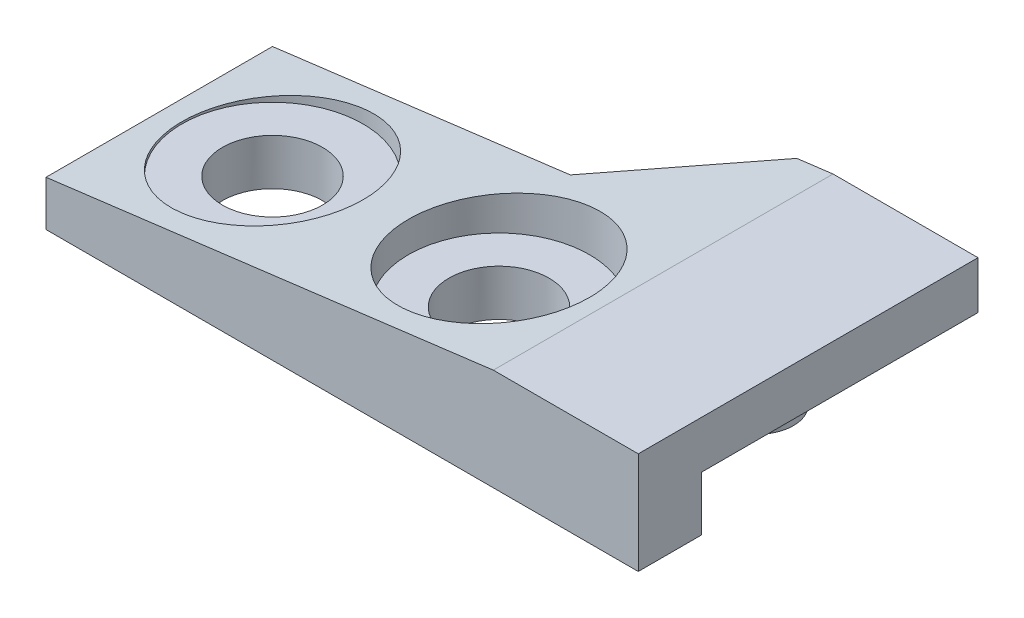
ISO-10303-21;
HEADER;
FILE_DESCRIPTION(('STEP AP214'),'2;1');
FILE_NAME('part.step','',(''),(''),'','','');
FILE_SCHEMA(('AUTOMOTIVE_DESIGN { 1 0 10303 214 1 1 1 1 }'));
ENDSEC;
DATA;
#1=APPLICATION_CONTEXT('core data for automotive mechanical design processes');
#2=APPLICATION_PROTOCOL_DEFINITION('international standard','automotive_design',2000,#1);
#3=PRODUCT_CONTEXT('',#1,'mechanical');
#4=PRODUCT('Part','Part','',(#3));
#5=PRODUCT_RELATED_PRODUCT_CATEGORY('part','',(#4));
#6=PRODUCT_DEFINITION_FORMATION('','',#4);
#7=PRODUCT_DEFINITION_CONTEXT('part definition',#1,'design');
#8=PRODUCT_DEFINITION('design','',#6,#7);
#9=PRODUCT_DEFINITION_SHAPE('','',#8);
#10=(LENGTH_UNIT() NAMED_UNIT(*) SI_UNIT(.MILLI.,.METRE.));
#11=(NAMED_UNIT(*) PLANE_ANGLE_UNIT() SI_UNIT($,.RADIAN.));
#12=(NAMED_UNIT(*) SI_UNIT($,.STERADIAN.) SOLID_ANGLE_UNIT());
#13=UNCERTAINTY_MEASURE_WITH_UNIT(LENGTH_MEASURE(1.E-05),#10,'distance_accuracy_value','');
#14=(GEOMETRIC_REPRESENTATION_CONTEXT(3) GLOBAL_UNCERTAINTY_ASSIGNED_CONTEXT((#13)) GLOBAL_UNIT_ASSIGNED_CONTEXT((#10,
#11,#12)) REPRESENTATION_CONTEXT('',''));
#15=CARTESIAN_POINT('',(0.,0.,0.));
#16=DIRECTION('',(0.,0.,1.));
#17=DIRECTION('',(1.,0.,0.));
#18=AXIS2_PLACEMENT_3D('',#15,#16,#17);
#19=CARTESIAN_POINT('',(-49.7205,0.,-4.59678591487508E-13));
#20=DIRECTION('',(1.,0.,0.));
#21=DIRECTION('',(0.,0.,1.));
#22=AXIS2_PLACEMENT_3D('',#19,#20,#21);
#23=PLANE('',#22);
#24=CARTESIAN_POINT('',(-49.7205,2.54,-4.59678591487508E-13));
#25=DIRECTION('',(0.,-1.,0.));
#26=VECTOR('',#25,1.);
#27=LINE('',#24,#26);
#28=CARTESIAN_POINT('',(-49.7205,2.54,-4.59678591487508E-13));
#29=VERTEX_POINT('',#28);
#30=CARTESIAN_POINT('',(-49.7205,0.,-4.59678591487508E-13));
#31=VERTEX_POINT('',#30);
#32=EDGE_CURVE('E229',#29,#31,#27,.T.);
#33=ORIENTED_EDGE('',*,*,#32,.F.);
#34=CARTESIAN_POINT('',(-49.7204999999998,2.54,-12.7000000000005));
#35=DIRECTION('',(0.,0.,1.));
#36=VECTOR('',#35,1.);
#37=LINE('',#34,#36);
#38=CARTESIAN_POINT('',(-49.7204999999998,2.54,-12.7000000000005));
#39=VERTEX_POINT('',#38);
#40=EDGE_CURVE('E676',#39,#29,#37,.T.);
#41=ORIENTED_EDGE('',*,*,#40,.F.);
#42=CARTESIAN_POINT('',(-49.7204999999998,0.,-12.7000000000005));
#43=DIRECTION('',(0.,1.,0.));
#44=VECTOR('',#43,1.);
#45=LINE('',#42,#44);
#46=CARTESIAN_POINT('',(-49.7204999999998,0.,-12.7000000000005));
#47=VERTEX_POINT('',#46);
#48=EDGE_CURVE('E479',#47,#39,#45,.T.);
#49=ORIENTED_EDGE('',*,*,#48,.F.);
#50=CARTESIAN_POINT('',(-49.7205,0.,-4.59678591487508E-13));
#51=DIRECTION('',(0.,0.,-1.));
#52=VECTOR('',#51,1.);
#53=LINE('',#50,#52);
#54=EDGE_CURVE('E285',#31,#47,#53,.T.);
#55=ORIENTED_EDGE('',*,*,#54,.F.);
#56=EDGE_LOOP('',(#33,#41,#49,#55));
#57=FACE_BOUND('',#56,.T.);
#58=ADVANCED_FACE('F49',(#57),#23,.F.);
#59=CARTESIAN_POINT('',(-33.02,0.,-2.28520905902011E-13));
#60=DIRECTION('',(0.,-1.,0.));
#61=DIRECTION('',(0.,0.,-1.));
#62=AXIS2_PLACEMENT_3D('',#59,#60,#61);
#63=PLANE('',#62);
#64=DIRECTION('',(1.,0.,0.));
#65=VECTOR('',#64,1.);
#66=CARTESIAN_POINT('',(-16.5100000000001,0.,-3.556));
#67=LINE('',#66,#65);
#68=CARTESIAN_POINT('',(-26.0350000000001,0.,-3.55600000000013));
#69=VERTEX_POINT('',#68);
#70=CARTESIAN_POINT('',(-16.5100000000001,0.,-3.556));
#71=VERTEX_POINT('',#70);
#72=EDGE_CURVE('E153',#69,#71,#67,.T.);
#73=ORIENTED_EDGE('',*,*,#72,.T.);
#74=CARTESIAN_POINT('',(-16.5100000000001,0.,-3.556));
#75=DIRECTION('',(0.,0.,1.));
#76=VECTOR('',#75,1.);
#77=LINE('',#74,#76);
#78=CARTESIAN_POINT('',(-16.51,0.,-1.46938232624621E-13));
#79=VERTEX_POINT('',#78);
#80=EDGE_CURVE('E167',#71,#79,#77,.T.);
#81=ORIENTED_EDGE('',*,*,#80,.T.);
#82=DIRECTION('',(1.,0.,0.));
#83=VECTOR('',#82,1.);
#84=CARTESIAN_POINT('',(-49.7205,0.,-4.59678591487508E-13));
#85=LINE('',#84,#83);
#86=EDGE_CURVE('E290',#31,#79,#85,.T.);
#87=ORIENTED_EDGE('',*,*,#86,.F.);
#88=ORIENTED_EDGE('',*,*,#54,.T.);
#89=DIRECTION('',(1.,0.,0.));
#90=VECTOR('',#89,1.);
#91=CARTESIAN_POINT('',(-49.7204999999998,0.,-12.7000000000005));
#92=LINE('',#91,#90);
#93=CARTESIAN_POINT('',(-33.0199999999998,0.,-12.7000000000002));
#94=VERTEX_POINT('',#93);
#95=EDGE_CURVE('E299',#47,#94,#92,.T.);
#96=ORIENTED_EDGE('',*,*,#95,.T.);
#97=DIRECTION('',(0.707106781186553,0.,-0.707106781186542));
#98=VECTOR('',#97,1.);
#99=CARTESIAN_POINT('',(-33.0199999999998,0.,-12.7000000000002));
#100=LINE('',#99,#98);
#101=CARTESIAN_POINT('',(-26.6699999999997,0.,-19.0500000000003));
#102=VERTEX_POINT('',#101);
#103=EDGE_CURVE('E248',#94,#102,#100,.T.);
#104=ORIENTED_EDGE('',*,*,#103,.T.);
#105=DIRECTION('',(1.,0.,0.));
#106=VECTOR('',#105,1.);
#107=CARTESIAN_POINT('',(-26.6699999999997,0.,-19.0500000000003));
#108=LINE('',#107,#106);
#109=CARTESIAN_POINT('',(-26.0349999999999,0.,-19.0500000000003));
#110=VERTEX_POINT('',#109);
#111=EDGE_CURVE('E258',#102,#110,#108,.T.);
#112=ORIENTED_EDGE('',*,*,#111,.T.);
#113=DIRECTION('',(0.,0.,1.));
#114=VECTOR('',#113,1.);
#115=CARTESIAN_POINT('',(-26.0350000000001,0.,-3.55600000000013));
#116=LINE('',#115,#114);
#117=EDGE_CURVE('E448',#110,#69,#116,.T.);
#118=ORIENTED_EDGE('',*,*,#117,.T.);
#119=EDGE_LOOP('',(#73,#81,#87,#88,#96,#104,#112,#118));
#120=FACE_BOUND('',#119,.T.);
#121=CARTESIAN_POINT('',(-43.3704999999999,0.,-6.35000000000037));
#122=DIRECTION('',(0.,1.,0.));
#123=DIRECTION('',(0.,0.,-1.));
#124=AXIS2_PLACEMENT_3D('',#121,#122,#123);
#125=CIRCLE('',#124,2.8067);
#126=CARTESIAN_POINT('',(-43.3704999999999,0.,-9.15670000000037));
#127=VERTEX_POINT('',#126);
#128=EDGE_CURVE('E351',#127,#127,#125,.T.);
#129=ORIENTED_EDGE('',*,*,#128,.T.);
#130=EDGE_LOOP('',(#129));
#131=FACE_BOUND('',#130,.T.);
#132=CARTESIAN_POINT('',(-30.6704999999999,0.,-6.3500000000002));
#133=DIRECTION('',(0.,1.,0.));
#134=DIRECTION('',(0.,0.,-1.));
#135=AXIS2_PLACEMENT_3D('',#132,#133,#134);
#136=CIRCLE('',#135,2.8067);
#137=CARTESIAN_POINT('',(-30.6704999999999,0.,-9.15670000000019));
#138=VERTEX_POINT('',#137);
#139=EDGE_CURVE('E341',#138,#138,#136,.T.);
#140=ORIENTED_EDGE('',*,*,#139,.T.);
#141=EDGE_LOOP('',(#140));
#142=FACE_BOUND('',#141,.T.);
#143=ADVANCED_FACE('F199',(#120,#131,#142),#63,.T.);
#144=CARTESIAN_POINT('',(-33.0199999999998,0.,-12.7000000000002));
#145=DIRECTION('',(0.,0.,-1.));
#146=DIRECTION('',(1.,0.,0.));
#147=AXIS2_PLACEMENT_3D('',#144,#145,#146);
#148=PLANE('',#147);
#149=ORIENTED_EDGE('',*,*,#95,.F.);
#150=ORIENTED_EDGE('',*,*,#48,.T.);
#151=DIRECTION('',(0.992083472687499,0.125580186416139,0.));
#152=VECTOR('',#151,1.);
#153=CARTESIAN_POINT('',(-49.7204999999998,2.54,-12.7000000000005));
#154=LINE('',#153,#152);
#155=CARTESIAN_POINT('',(-33.0199999999998,4.65398734177215,-12.7000000000002));
#156=VERTEX_POINT('',#155);
#157=EDGE_CURVE('E243',#39,#156,#154,.T.);
#158=ORIENTED_EDGE('',*,*,#157,.T.);
#159=DIRECTION('',(0.,1.,0.));
#160=VECTOR('',#159,1.);
#161=CARTESIAN_POINT('',(-33.0199999999998,0.,-12.7000000000002));
#162=LINE('',#161,#160);
#163=EDGE_CURVE('E233',#94,#156,#162,.T.);
#164=ORIENTED_EDGE('',*,*,#163,.F.);
#165=EDGE_LOOP('',(#149,#150,#158,#164));
#166=FACE_BOUND('',#165,.T.);
#167=ADVANCED_FACE('F321',(#166),#148,.T.);
#168=CARTESIAN_POINT('',(-33.02,0.,-2.28520905902011E-13));
#169=DIRECTION('',(0.,0.,1.));
#170=DIRECTION('',(-1.,0.,0.));
#171=AXIS2_PLACEMENT_3D('',#168,#169,#170);
#172=PLANE('',#171);
#173=DIRECTION('',(0.992083472687499,0.125580186416139,0.));
#174=VECTOR('',#173,1.);
#175=CARTESIAN_POINT('',(-49.7205,2.54,-4.59678591487508E-13));
#176=LINE('',#175,#174);
#177=CARTESIAN_POINT('',(-24.638,5.715,-1.12502599828683E-13));
#178=VERTEX_POINT('',#177);
#179=EDGE_CURVE('E304',#29,#178,#176,.T.);
#180=ORIENTED_EDGE('',*,*,#179,.F.);
#181=ORIENTED_EDGE('',*,*,#32,.T.);
#182=ORIENTED_EDGE('',*,*,#86,.T.);
#183=CARTESIAN_POINT('',(-16.51,0.,0.));
#184=DIRECTION('',(0.,1.,0.));
#185=VECTOR('',#184,1.);
#186=LINE('',#183,#185);
#187=CARTESIAN_POINT('',(-16.51,5.715,0.));
#188=VERTEX_POINT('',#187);
#189=EDGE_CURVE('E346',#79,#188,#186,.T.);
#190=ORIENTED_EDGE('',*,*,#189,.T.);
#191=DIRECTION('',(1.,0.,0.));
#192=VECTOR('',#191,1.);
#193=CARTESIAN_POINT('',(-24.638,5.715,-1.12502599828683E-13));
#194=LINE('',#193,#192);
#195=EDGE_CURVE('E334',#178,#188,#194,.T.);
#196=ORIENTED_EDGE('',*,*,#195,.F.);
#197=EDGE_LOOP('',(#180,#181,#182,#190,#196));
#198=FACE_BOUND('',#197,.T.);
#199=ADVANCED_FACE('F313',(#198),#172,.T.);
#200=CARTESIAN_POINT('',(-33.5998217946696,4.58059217788992,-2.36546429934696E-13));
#201=DIRECTION('',(-0.125580186416139,0.992083472687499,0.));
#202=DIRECTION('',(0.992083472687499,0.125580186416139,0.));
#203=AXIS2_PLACEMENT_3D('',#200,#201,#202);
#204=PLANE('',#203);
#205=CARTESIAN_POINT('',(-43.3704999999999,3.34379746835443,-6.35000000000037));
#206=DIRECTION('',(0.125580186416139,-0.992083472687499,0.));
#207=DIRECTION('',(0.992083472687499,0.125580186416139,0.));
#208=AXIS2_PLACEMENT_3D('',#205,#206,#207);
#209=ELLIPSE('',#208,5.12053686998591,5.08);
#210=CARTESIAN_POINT('',(-38.2904999999999,3.98683544303798,-6.35000000000031));
#211=VERTEX_POINT('',#210);
#212=EDGE_CURVE('E347',#211,#211,#209,.T.);
#213=ORIENTED_EDGE('',*,*,#212,.T.);
#214=EDGE_LOOP('',(#213));
#215=FACE_BOUND('',#214,.T.);
#216=CARTESIAN_POINT('',(-30.6704999999999,4.95139240506329,-6.3500000000002));
#217=DIRECTION('',(0.125580186416139,-0.992083472687499,0.));
#218=DIRECTION('',(0.992083472687499,0.125580186416139,0.));
#219=AXIS2_PLACEMENT_3D('',#216,#217,#218);
#220=ELLIPSE('',#219,5.12053686998591,5.08);
#221=CARTESIAN_POINT('',(-25.5904999999999,5.59443037974684,-6.35000000000013));
#222=VERTEX_POINT('',#221);
#223=EDGE_CURVE('E337',#222,#222,#220,.T.);
#224=ORIENTED_EDGE('',*,*,#223,.T.);
#225=EDGE_LOOP('',(#224));
#226=FACE_BOUND('',#225,.T.);
#227=ORIENTED_EDGE('',*,*,#157,.F.);
#228=ORIENTED_EDGE('',*,*,#40,.T.);
#229=ORIENTED_EDGE('',*,*,#179,.T.);
#230=DIRECTION('',(0.,0.,1.));
#231=VECTOR('',#230,1.);
#232=CARTESIAN_POINT('',(-24.638,5.715,-1.12502599828683E-13));
#233=LINE('',#232,#231);
#234=CARTESIAN_POINT('',(-24.6379999999997,5.715,-19.0500000000003));
#235=VERTEX_POINT('',#234);
#236=EDGE_CURVE('E264',#235,#178,#233,.T.);
#237=ORIENTED_EDGE('',*,*,#236,.F.);
#238=DIRECTION('',(0.992083472687499,0.125580186416138,0.));
#239=VECTOR('',#238,1.);
#240=CARTESIAN_POINT('',(-26.6699999999997,5.45778481012659,-19.0500000000003));
#241=LINE('',#240,#239);
#242=CARTESIAN_POINT('',(-26.6699999999997,5.45778481012659,-19.0500000000003));
#243=VERTEX_POINT('',#242);
#244=EDGE_CURVE('E249',#243,#235,#241,.T.);
#245=ORIENTED_EDGE('',*,*,#244,.F.);
#246=DIRECTION('',(0.704291181960594,0.0891507825266565,-0.704291181960582));
#247=VECTOR('',#246,1.);
#248=CARTESIAN_POINT('',(-33.0199999999998,4.65398734177215,-12.7000000000002));
#249=LINE('',#248,#247);
#250=EDGE_CURVE('E256',#156,#243,#249,.T.);
#251=ORIENTED_EDGE('',*,*,#250,.F.);
#252=EDGE_LOOP('',(#227,#228,#229,#237,#245,#251));
#253=FACE_BOUND('',#252,.T.);
#254=ADVANCED_FACE('F51',(#215,#226,#253),#204,.T.);
#255=CARTESIAN_POINT('',(-39.3699999999999,0.,-6.35000000000025));
#256=DIRECTION('',(-0.707106781186542,0.,-0.707106781186553));
#257=DIRECTION('',(0.707106781186553,0.,-0.707106781186542));
#258=AXIS2_PLACEMENT_3D('',#255,#256,#257);
#259=PLANE('',#258);
#260=ORIENTED_EDGE('',*,*,#103,.F.);
#261=ORIENTED_EDGE('',*,*,#163,.T.);
#262=ORIENTED_EDGE('',*,*,#250,.T.);
#263=DIRECTION('',(0.,1.,0.));
#264=VECTOR('',#263,1.);
#265=CARTESIAN_POINT('',(-26.6699999999997,0.,-19.0500000000003));
#266=LINE('',#265,#264);
#267=EDGE_CURVE('E246',#102,#243,#266,.T.);
#268=ORIENTED_EDGE('',*,*,#267,.F.);
#269=EDGE_LOOP('',(#260,#261,#262,#268));
#270=FACE_BOUND('',#269,.T.);
#271=ADVANCED_FACE('F190',(#270),#259,.T.);
#272=CARTESIAN_POINT('',(-33.0199999999997,0.,-19.0500000000004));
#273=DIRECTION('',(0.,0.,-1.));
#274=DIRECTION('',(1.,0.,0.));
#275=AXIS2_PLACEMENT_3D('',#272,#273,#274);
#276=PLANE('',#275);
#277=DIRECTION('',(0.,-1.,0.));
#278=VECTOR('',#277,1.);
#279=CARTESIAN_POINT('',(-26.0349999999999,3.048,-19.0500000000003));
#280=LINE('',#279,#278);
#281=CARTESIAN_POINT('',(-26.0349999999999,3.048,-19.0500000000003));
#282=VERTEX_POINT('',#281);
#283=EDGE_CURVE('E437',#282,#110,#280,.T.);
#284=ORIENTED_EDGE('',*,*,#283,.T.);
#285=ORIENTED_EDGE('',*,*,#111,.F.);
#286=ORIENTED_EDGE('',*,*,#267,.T.);
#287=ORIENTED_EDGE('',*,*,#244,.T.);
#288=DIRECTION('',(1.,0.,0.));
#289=VECTOR('',#288,1.);
#290=CARTESIAN_POINT('',(-24.6379999999997,5.715,-19.0500000000003));
#291=LINE('',#290,#289);
#292=CARTESIAN_POINT('',(-16.5099999999999,5.715,-19.05));
#293=VERTEX_POINT('',#292);
#294=EDGE_CURVE('E165',#235,#293,#291,.T.);
#295=ORIENTED_EDGE('',*,*,#294,.T.);
#296=CARTESIAN_POINT('',(-16.5099999999999,5.715,-19.0500000000001));
#297=DIRECTION('',(0.,-1.,0.));
#298=VECTOR('',#297,1.);
#299=LINE('',#296,#298);
#300=CARTESIAN_POINT('',(-16.5099999999999,3.048,-19.0500000000001));
#301=VERTEX_POINT('',#300);
#302=EDGE_CURVE('E145',#293,#301,#299,.T.);
#303=ORIENTED_EDGE('',*,*,#302,.T.);
#304=DIRECTION('',(-1.,0.,0.));
#305=VECTOR('',#304,1.);
#306=CARTESIAN_POINT('',(-16.5099999999999,3.048,-19.0500000000001));
#307=LINE('',#306,#305);
#308=EDGE_CURVE('E152',#301,#282,#307,.T.);
#309=ORIENTED_EDGE('',*,*,#308,.T.);
#310=EDGE_LOOP('',(#284,#285,#286,#287,#295,#303,#309));
#311=FACE_BOUND('',#310,.T.);
#312=ADVANCED_FACE('F163',(#311),#276,.T.);
#313=CARTESIAN_POINT('',(-16.51,0.,-1.14260452951006E-13));
#314=DIRECTION('',(1.,0.,0.));
#315=DIRECTION('',(0.,0.,1.));
#316=AXIS2_PLACEMENT_3D('',#313,#314,#315);
#317=PLANE('',#316);
#318=DIRECTION('',(0.,-1.,0.));
#319=VECTOR('',#318,1.);
#320=CARTESIAN_POINT('',(-16.5100000000001,3.048,-3.556));
#321=LINE('',#320,#319);
#322=CARTESIAN_POINT('',(-16.51,3.048,-3.556));
#323=VERTEX_POINT('',#322);
#324=EDGE_CURVE('E149',#323,#71,#321,.T.);
#325=ORIENTED_EDGE('',*,*,#324,.F.);
#326=DIRECTION('',(0.,0.,-1.));
#327=VECTOR('',#326,1.);
#328=CARTESIAN_POINT('',(-16.5100000000001,3.048,-3.556));
#329=LINE('',#328,#327);
#330=EDGE_CURVE('E141',#323,#301,#329,.T.);
#331=ORIENTED_EDGE('',*,*,#330,.T.);
#332=ORIENTED_EDGE('',*,*,#302,.F.);
#333=CARTESIAN_POINT('',(-16.51,5.715,0.));
#334=DIRECTION('',(0.,0.,-1.));
#335=VECTOR('',#334,1.);
#336=LINE('',#333,#335);
#337=EDGE_CURVE('E168',#188,#293,#336,.T.);
#338=ORIENTED_EDGE('',*,*,#337,.F.);
#339=ORIENTED_EDGE('',*,*,#189,.F.);
#340=ORIENTED_EDGE('',*,*,#80,.F.);
#341=EDGE_LOOP('',(#325,#331,#332,#338,#339,#340));
#342=FACE_BOUND('',#341,.T.);
#343=ADVANCED_FACE('F143',(#342),#317,.T.);
#344=CARTESIAN_POINT('',(-33.02,5.71500000000001,-2.29301531466201E-13));
#345=DIRECTION('',(0.,-1.,0.));
#346=DIRECTION('',(-1.,0.,0.));
#347=AXIS2_PLACEMENT_3D('',#344,#345,#346);
#348=PLANE('',#347);
#349=ORIENTED_EDGE('',*,*,#294,.F.);
#350=ORIENTED_EDGE('',*,*,#236,.T.);
#351=ORIENTED_EDGE('',*,*,#195,.T.);
#352=ORIENTED_EDGE('',*,*,#337,.T.);
#353=EDGE_LOOP('',(#349,#350,#351,#352));
#354=FACE_BOUND('',#353,.T.);
#355=ADVANCED_FACE('F191',(#354),#348,.F.);
#356=CARTESIAN_POINT('',(-30.6704999999999,5.715,-6.3500000000002));
#357=DIRECTION('',(0.,1.,0.));
#358=DIRECTION('',(0.,0.,1.));
#359=AXIS2_PLACEMENT_3D('',#356,#357,#358);
#360=CYLINDRICAL_SURFACE('',#359,2.8067);
#361=ORIENTED_EDGE('',*,*,#139,.F.);
#362=EDGE_LOOP('',(#361));
#363=FACE_BOUND('',#362,.T.);
#364=CARTESIAN_POINT('',(-30.6704999999999,2.5908,-6.3500000000002));
#365=DIRECTION('',(0.,-1.,0.));
#366=DIRECTION('',(0.,0.,1.));
#367=AXIS2_PLACEMENT_3D('',#364,#365,#366);
#368=CIRCLE('',#367,2.8067);
#369=CARTESIAN_POINT('',(-30.6704999999999,2.5908,-3.5433000000002));
#370=VERTEX_POINT('',#369);
#371=EDGE_CURVE('E342',#370,#370,#368,.T.);
#372=ORIENTED_EDGE('',*,*,#371,.F.);
#373=EDGE_LOOP('',(#372));
#374=FACE_BOUND('',#373,.T.);
#375=ADVANCED_FACE('F382',(#363,#374),#360,.F.);
#376=CARTESIAN_POINT('',(-33.4771999999999,2.5908,-6.35000000000024));
#377=DIRECTION('',(0.,-1.,0.));
#378=DIRECTION('',(0.,0.,-1.));
#379=AXIS2_PLACEMENT_3D('',#376,#377,#378);
#380=PLANE('',#379);
#381=ORIENTED_EDGE('',*,*,#371,.T.);
#382=EDGE_LOOP('',(#381));
#383=FACE_BOUND('',#382,.T.);
#384=CARTESIAN_POINT('',(-30.6704999999999,2.5908,-6.3500000000002));
#385=DIRECTION('',(0.,-1.,0.));
#386=DIRECTION('',(0.,0.,1.));
#387=AXIS2_PLACEMENT_3D('',#384,#385,#386);
#388=CIRCLE('',#387,5.08);
#389=CARTESIAN_POINT('',(-26.0350000000001,2.5908,-4.27189034216172));
#390=VERTEX_POINT('',#389);
#391=CARTESIAN_POINT('',(-26.035,2.5908,-8.42810965783854));
#392=VERTEX_POINT('',#391);
#393=EDGE_CURVE('E356',#390,#392,#388,.T.);
#394=ORIENTED_EDGE('',*,*,#393,.F.);
#395=DIRECTION('',(0.,0.,1.));
#396=VECTOR('',#395,1.);
#397=CARTESIAN_POINT('',(-26.035,2.5908,-6.35000000000013));
#398=LINE('',#397,#396);
#399=EDGE_CURVE('E428',#392,#390,#398,.T.);
#400=ORIENTED_EDGE('',*,*,#399,.F.);
#401=EDGE_LOOP('',(#394,#400));
#402=FACE_BOUND('',#401,.T.);
#403=ADVANCED_FACE('F489',(#383,#402),#380,.F.);
#404=CARTESIAN_POINT('',(-30.6704999999999,5.715,-6.3500000000002));
#405=DIRECTION('',(0.,1.,0.));
#406=DIRECTION('',(0.,0.,1.));
#407=AXIS2_PLACEMENT_3D('',#404,#405,#406);
#408=CYLINDRICAL_SURFACE('',#407,5.08);
#409=ORIENTED_EDGE('',*,*,#223,.F.);
#410=EDGE_LOOP('',(#409));
#411=FACE_BOUND('',#410,.T.);
#412=CARTESIAN_POINT('',(-30.6704999999999,3.048,-6.3500000000002));
#413=DIRECTION('',(0.,1.,0.));
#414=DIRECTION('',(0.,0.,-1.));
#415=AXIS2_PLACEMENT_3D('',#412,#413,#414);
#416=CIRCLE('',#415,5.08);
#417=CARTESIAN_POINT('',(-26.035,3.048,-8.42810965783854));
#418=VERTEX_POINT('',#417);
#419=CARTESIAN_POINT('',(-26.0350000000001,3.048,-4.27189034216173));
#420=VERTEX_POINT('',#419);
#421=EDGE_CURVE('E242',#418,#420,#416,.F.);
#422=ORIENTED_EDGE('',*,*,#421,.T.);
#423=DIRECTION('',(0.,1.,0.));
#424=VECTOR('',#423,1.);
#425=CARTESIAN_POINT('',(-26.0350000000001,5.715,-4.27189034216172));
#426=LINE('',#425,#424);
#427=EDGE_CURVE('E60',#390,#420,#426,.T.);
#428=ORIENTED_EDGE('',*,*,#427,.F.);
#429=ORIENTED_EDGE('',*,*,#393,.T.);
#430=DIRECTION('',(0.,1.,0.));
#431=VECTOR('',#430,1.);
#432=CARTESIAN_POINT('',(-26.035,5.715,-8.42810965783854));
#433=LINE('',#432,#431);
#434=EDGE_CURVE('E11',#418,#392,#433,.F.);
#435=ORIENTED_EDGE('',*,*,#434,.F.);
#436=EDGE_LOOP('',(#422,#428,#429,#435));
#437=FACE_BOUND('',#436,.T.);
#438=ADVANCED_FACE('F485',(#411,#437),#408,.F.);
#439=CARTESIAN_POINT('',(-43.3704999999999,5.71500000000001,-6.35000000000037));
#440=DIRECTION('',(0.,1.,0.));
#441=DIRECTION('',(0.,0.,1.));
#442=AXIS2_PLACEMENT_3D('',#439,#440,#441);
#443=CYLINDRICAL_SURFACE('',#442,2.8067);
#444=ORIENTED_EDGE('',*,*,#128,.F.);
#445=EDGE_LOOP('',(#444));
#446=FACE_BOUND('',#445,.T.);
#447=CARTESIAN_POINT('',(-43.3704999999999,2.59080000000001,-6.35000000000037));
#448=DIRECTION('',(0.,-1.,0.));
#449=DIRECTION('',(0.,0.,1.));
#450=AXIS2_PLACEMENT_3D('',#447,#448,#449);
#451=CIRCLE('',#450,2.8067);
#452=CARTESIAN_POINT('',(-43.3705,2.59080000000001,-3.54330000000037));
#453=VERTEX_POINT('',#452);
#454=EDGE_CURVE('E352',#453,#453,#451,.T.);
#455=ORIENTED_EDGE('',*,*,#454,.F.);
#456=EDGE_LOOP('',(#455));
#457=FACE_BOUND('',#456,.T.);
#458=ADVANCED_FACE('F496',(#446,#457),#443,.F.);
#459=CARTESIAN_POINT('',(-46.1771999999999,2.59080000000001,-6.35000000000041));
#460=DIRECTION('',(0.,-1.,0.));
#461=DIRECTION('',(0.,0.,-1.));
#462=AXIS2_PLACEMENT_3D('',#459,#460,#461);
#463=PLANE('',#462);
#464=ORIENTED_EDGE('',*,*,#454,.T.);
#465=EDGE_LOOP('',(#464));
#466=FACE_BOUND('',#465,.T.);
#467=CARTESIAN_POINT('',(-43.3704999999999,2.59080000000001,-6.35000000000037));
#468=DIRECTION('',(0.,-1.,0.));
#469=DIRECTION('',(0.,0.,1.));
#470=AXIS2_PLACEMENT_3D('',#467,#468,#469);
#471=CIRCLE('',#470,5.08);
#472=CARTESIAN_POINT('',(-43.3705,2.59080000000001,-1.27000000000037));
#473=VERTEX_POINT('',#472);
#474=EDGE_CURVE('E424',#473,#473,#471,.T.);
#475=ORIENTED_EDGE('',*,*,#474,.F.);
#476=EDGE_LOOP('',(#475));
#477=FACE_BOUND('',#476,.T.);
#478=ADVANCED_FACE('F503',(#466,#477),#463,.F.);
#479=CARTESIAN_POINT('',(-43.3704999999999,5.71500000000001,-6.35000000000037));
#480=DIRECTION('',(0.,1.,0.));
#481=DIRECTION('',(0.,0.,1.));
#482=AXIS2_PLACEMENT_3D('',#479,#480,#481);
#483=CYLINDRICAL_SURFACE('',#482,5.08);
#484=ORIENTED_EDGE('',*,*,#212,.F.);
#485=EDGE_LOOP('',(#484));
#486=FACE_BOUND('',#485,.T.);
#487=ORIENTED_EDGE('',*,*,#474,.T.);
#488=EDGE_LOOP('',(#487));
#489=FACE_BOUND('',#488,.T.);
#490=ADVANCED_FACE('F507',(#486,#489),#483,.F.);
#491=CARTESIAN_POINT('',(-26.0350000000001,3.048,-3.55600000000013));
#492=DIRECTION('',(-1.,0.,0.));
#493=DIRECTION('',(0.,0.,-1.));
#494=AXIS2_PLACEMENT_3D('',#491,#492,#493);
#495=PLANE('',#494);
#496=DIRECTION('',(0.,0.,1.));
#497=VECTOR('',#496,1.);
#498=CARTESIAN_POINT('',(-26.0350000000001,3.048,-3.55600000000013));
#499=LINE('',#498,#497);
#500=EDGE_CURVE('E75',#282,#418,#499,.T.);
#501=ORIENTED_EDGE('',*,*,#500,.T.);
#502=ORIENTED_EDGE('',*,*,#434,.T.);
#503=ORIENTED_EDGE('',*,*,#399,.T.);
#504=ORIENTED_EDGE('',*,*,#427,.T.);
#505=CARTESIAN_POINT('',(-26.0350000000001,3.048,-3.55600000000013));
#506=VERTEX_POINT('',#505);
#507=EDGE_CURVE('E160',#420,#506,#499,.T.);
#508=ORIENTED_EDGE('',*,*,#507,.T.);
#509=DIRECTION('',(0.,-1.,0.));
#510=VECTOR('',#509,1.);
#511=CARTESIAN_POINT('',(-26.0350000000001,3.048,-3.55600000000013));
#512=LINE('',#511,#510);
#513=EDGE_CURVE('E434',#506,#69,#512,.T.);
#514=ORIENTED_EDGE('',*,*,#513,.T.);
#515=ORIENTED_EDGE('',*,*,#117,.F.);
#516=ORIENTED_EDGE('',*,*,#283,.F.);
#517=EDGE_LOOP('',(#501,#502,#503,#504,#508,#514,#515,#516));
#518=FACE_BOUND('',#517,.T.);
#519=ADVANCED_FACE('F483',(#518),#495,.F.);
#520=CARTESIAN_POINT('',(-33.02,3.048,-2.28520905902011E-13));
#521=DIRECTION('',(0.,-1.,0.));
#522=DIRECTION('',(0.,0.,-1.));
#523=AXIS2_PLACEMENT_3D('',#520,#521,#522);
#524=PLANE('',#523);
#525=CARTESIAN_POINT('',(-21.2725,3.048,-11.4300000000002));
#526=DIRECTION('',(0.,1.,0.));
#527=DIRECTION('',(0.,0.,-1.));
#528=AXIS2_PLACEMENT_3D('',#525,#526,#527);
#529=CIRCLE('',#528,2.032);
#530=CARTESIAN_POINT('',(-21.2725,3.048,-13.4620000000002));
#531=VERTEX_POINT('',#530);
#532=EDGE_CURVE('E450',#531,#531,#529,.T.);
#533=ORIENTED_EDGE('',*,*,#532,.T.);
#534=EDGE_LOOP('',(#533));
#535=FACE_BOUND('',#534,.T.);
#536=ORIENTED_EDGE('',*,*,#421,.F.);
#537=ORIENTED_EDGE('',*,*,#500,.F.);
#538=ORIENTED_EDGE('',*,*,#308,.F.);
#539=ORIENTED_EDGE('',*,*,#330,.F.);
#540=DIRECTION('',(1.,0.,0.));
#541=VECTOR('',#540,1.);
#542=CARTESIAN_POINT('',(-16.5100000000001,3.048,-3.556));
#543=LINE('',#542,#541);
#544=EDGE_CURVE('E68',#506,#323,#543,.T.);
#545=ORIENTED_EDGE('',*,*,#544,.F.);
#546=ORIENTED_EDGE('',*,*,#507,.F.);
#547=EDGE_LOOP('',(#536,#537,#538,#539,#545,#546));
#548=FACE_BOUND('',#547,.T.);
#549=ADVANCED_FACE('F157',(#535,#548),#524,.T.);
#550=CARTESIAN_POINT('',(-16.5100000000001,3.048,-3.556));
#551=DIRECTION('',(0.,0.,1.));
#552=DIRECTION('',(-1.,0.,0.));
#553=AXIS2_PLACEMENT_3D('',#550,#551,#552);
#554=PLANE('',#553);
#555=ORIENTED_EDGE('',*,*,#72,.F.);
#556=ORIENTED_EDGE('',*,*,#513,.F.);
#557=ORIENTED_EDGE('',*,*,#544,.T.);
#558=ORIENTED_EDGE('',*,*,#324,.T.);
#559=EDGE_LOOP('',(#555,#556,#557,#558));
#560=FACE_BOUND('',#559,.T.);
#561=ADVANCED_FACE('F467',(#560),#554,.F.);
#562=CARTESIAN_POINT('',(-21.2725,3.048,-11.4300000000002));
#563=DIRECTION('',(0.,-1.,0.));
#564=DIRECTION('',(0.,0.,-1.));
#565=AXIS2_PLACEMENT_3D('',#562,#563,#564);
#566=CYLINDRICAL_SURFACE('',#565,2.032);
#567=CARTESIAN_POINT('',(-21.2725,0.,-11.4300000000002));
#568=DIRECTION('',(0.,1.,0.));
#569=DIRECTION('',(0.,0.,-1.));
#570=AXIS2_PLACEMENT_3D('',#567,#568,#569);
#571=CIRCLE('',#570,2.032);
#572=CARTESIAN_POINT('',(-21.2725,0.,-13.4620000000002));
#573=VERTEX_POINT('',#572);
#574=EDGE_CURVE('E454',#573,#573,#571,.T.);
#575=CARTESIAN_POINT('',(-21.2725,3.048,-13.4620000000002));
#576=CARTESIAN_POINT('',(-21.2725,3.01625,-13.4620000000002));
#577=CARTESIAN_POINT('',(-21.2725,2.9845,-13.4620000000002));
#578=CARTESIAN_POINT('',(-21.2725,2.921,-13.4620000000002));
#579=CARTESIAN_POINT('',(-21.2725,2.88925,-13.4620000000002));
#580=CARTESIAN_POINT('',(-21.2725,2.82575,-13.4620000000002));
#581=CARTESIAN_POINT('',(-21.2725,2.794,-13.4620000000002));
#582=CARTESIAN_POINT('',(-21.2725,2.7305,-13.4620000000002));
#583=CARTESIAN_POINT('',(-21.2725,2.69875,-13.4620000000002));
#584=CARTESIAN_POINT('',(-21.2725,2.63525,-13.4620000000002));
#585=CARTESIAN_POINT('',(-21.2725,2.6035,-13.4620000000002));
#586=CARTESIAN_POINT('',(-21.2725,2.54,-13.4620000000002));
#587=CARTESIAN_POINT('',(-21.2725,2.50825,-13.4620000000002));
#588=CARTESIAN_POINT('',(-21.2725,2.44475,-13.4620000000002));
#589=CARTESIAN_POINT('',(-21.2725,2.413,-13.4620000000002));
#590=CARTESIAN_POINT('',(-21.2725,2.3495,-13.4620000000002));
#591=CARTESIAN_POINT('',(-21.2725,2.31775,-13.4620000000002));
#592=CARTESIAN_POINT('',(-21.2725,2.25425,-13.4620000000002));
#593=CARTESIAN_POINT('',(-21.2725,2.2225,-13.4620000000002));
#594=CARTESIAN_POINT('',(-21.2725,2.159,-13.4620000000002));
#595=CARTESIAN_POINT('',(-21.2725,2.12725,-13.4620000000002));
#596=CARTESIAN_POINT('',(-21.2725,2.06375,-13.4620000000002));
#597=CARTESIAN_POINT('',(-21.2725,2.032,-13.4620000000002));
#598=CARTESIAN_POINT('',(-21.2725,1.9685,-13.4620000000002));
#599=CARTESIAN_POINT('',(-21.2725,1.93675,-13.4620000000002));
#600=CARTESIAN_POINT('',(-21.2725,1.87325,-13.4620000000002));
#601=CARTESIAN_POINT('',(-21.2725,1.8415,-13.4620000000002));
#602=CARTESIAN_POINT('',(-21.2725,1.778,-13.4620000000002));
#603=CARTESIAN_POINT('',(-21.2725,1.74625,-13.4620000000002));
#604=CARTESIAN_POINT('',(-21.2725,1.68275,-13.4620000000002));
#605=CARTESIAN_POINT('',(-21.2725,1.651,-13.4620000000002));
#606=CARTESIAN_POINT('',(-21.2725,1.5875,-13.4620000000002));
#607=CARTESIAN_POINT('',(-21.2725,1.55575,-13.4620000000002));
#608=CARTESIAN_POINT('',(-21.2725,1.49225,-13.4620000000002));
#609=CARTESIAN_POINT('',(-21.2725,1.4605,-13.4620000000002));
#610=CARTESIAN_POINT('',(-21.2725,1.397,-13.4620000000002));
#611=CARTESIAN_POINT('',(-21.2725,1.36525,-13.4620000000002));
#612=CARTESIAN_POINT('',(-21.2725,1.30175,-13.4620000000002));
#613=CARTESIAN_POINT('',(-21.2725,1.27,-13.4620000000002));
#614=CARTESIAN_POINT('',(-21.2725,1.2065,-13.4620000000002));
#615=CARTESIAN_POINT('',(-21.2725,1.17475,-13.4620000000002));
#616=CARTESIAN_POINT('',(-21.2725,1.11125,-13.4620000000002));
#617=CARTESIAN_POINT('',(-21.2725,1.0795,-13.4620000000002));
#618=CARTESIAN_POINT('',(-21.2725,1.016,-13.4620000000002));
#619=CARTESIAN_POINT('',(-21.2725,0.98425,-13.4620000000002));
#620=CARTESIAN_POINT('',(-21.2725,0.92075,-13.4620000000002));
#621=CARTESIAN_POINT('',(-21.2725,0.889,-13.4620000000002));
#622=CARTESIAN_POINT('',(-21.2725,0.8255,-13.4620000000002));
#623=CARTESIAN_POINT('',(-21.2725,0.79375,-13.4620000000002));
#624=CARTESIAN_POINT('',(-21.2725,0.73025,-13.4620000000002));
#625=CARTESIAN_POINT('',(-21.2725,0.6985,-13.4620000000002));
#626=CARTESIAN_POINT('',(-21.2725,0.635,-13.4620000000002));
#627=CARTESIAN_POINT('',(-21.2725,0.60325,-13.4620000000002));
#628=CARTESIAN_POINT('',(-21.2725,0.53975,-13.4620000000002));
#629=CARTESIAN_POINT('',(-21.2725,0.508,-13.4620000000002));
#630=CARTESIAN_POINT('',(-21.2725,0.4445,-13.4620000000002));
#631=CARTESIAN_POINT('',(-21.2725,0.41275,-13.4620000000002));
#632=CARTESIAN_POINT('',(-21.2725,0.34925,-13.4620000000002));
#633=CARTESIAN_POINT('',(-21.2725,0.3175,-13.4620000000002));
#634=CARTESIAN_POINT('',(-21.2725,0.254,-13.4620000000002));
#635=CARTESIAN_POINT('',(-21.2725,0.22225,-13.4620000000002));
#636=CARTESIAN_POINT('',(-21.2725,0.15875,-13.4620000000002));
#637=CARTESIAN_POINT('',(-21.2725,0.127,-13.4620000000002));
#638=CARTESIAN_POINT('',(-21.2725,0.0634999999999999,-13.4620000000002));
#639=CARTESIAN_POINT('',(-21.2725,0.03175,-13.4620000000002));
#640=CARTESIAN_POINT('',(-21.2725,0.,-13.4620000000002));
#641=B_SPLINE_CURVE_WITH_KNOTS('',3,(#575,#576,#577,#578,#579,#580,#581,#582,#583,#584,#585,
#586,#587,#588,#589,#590,#591,#592,#593,#594,#595,#596,#597,#598,#599,#600,#601,#602,#603,#604,
#605,#606,#607,#608,#609,#610,#611,#612,#613,#614,#615,#616,#617,#618,#619,#620,#621,#622,#623,
#624,#625,#626,#627,#628,#629,#630,#631,#632,#633,#634,#635,#636,#637,#638,#639,#640),
.UNSPECIFIED.,.F.,.F.,(4,2,2,2,2,2,2,2,2,2,2,2,2,2,2,2,2,2,2,2,2,2,2,2,2,2,2,2,2,2,2,2,4),(0.,
0.0952500000000003,0.1905,0.28575,0.381,0.47625,0.5715,0.66675,0.762,0.85725,0.9525,1.04775,
1.143,1.23825,1.3335,1.42875,1.524,1.61925,1.7145,1.80975,1.905,2.00025,2.0955,2.19075,2.286,
2.38125,2.4765,2.57175,2.667,2.76225,2.8575,2.95275,3.048),.UNSPECIFIED.);
#642=EDGE_CURVE('BSEAM460',#531,#573,#641,.T.);
#643=ORIENTED_EDGE('',*,*,#532,.F.);
#644=ORIENTED_EDGE('',*,*,#574,.T.);
#645=ORIENTED_EDGE('',*,*,#642,.T.);
#646=ORIENTED_EDGE('',*,*,#642,.F.);
#647=EDGE_LOOP('',(#643,#645,#644,#646));
#648=FACE_BOUND('',#647,.T.);
#649=ADVANCED_FACE('F460',(#648),#566,.T.);
#650=ORIENTED_EDGE('',*,*,#574,.F.);
#651=EDGE_LOOP('',(#650));
#652=FACE_BOUND('',#651,.T.);
#653=ADVANCED_FACE('F462',(#652),#63,.T.);
#654=CLOSED_SHELL('',(#58,#143,#167,#199,#254,#271,#312,#343,#355,#375,#403,#438,#458,#478,#490,
#519,#549,#561,#649,#653));
#655=MANIFOLD_SOLID_BREP('B2',#654);
#656=ADVANCED_BREP_SHAPE_REPRESENTATION('',(#18,#655),#14);
#657=SHAPE_DEFINITION_REPRESENTATION(#9,#656);
ENDSEC;
END-ISO-10303-21;
